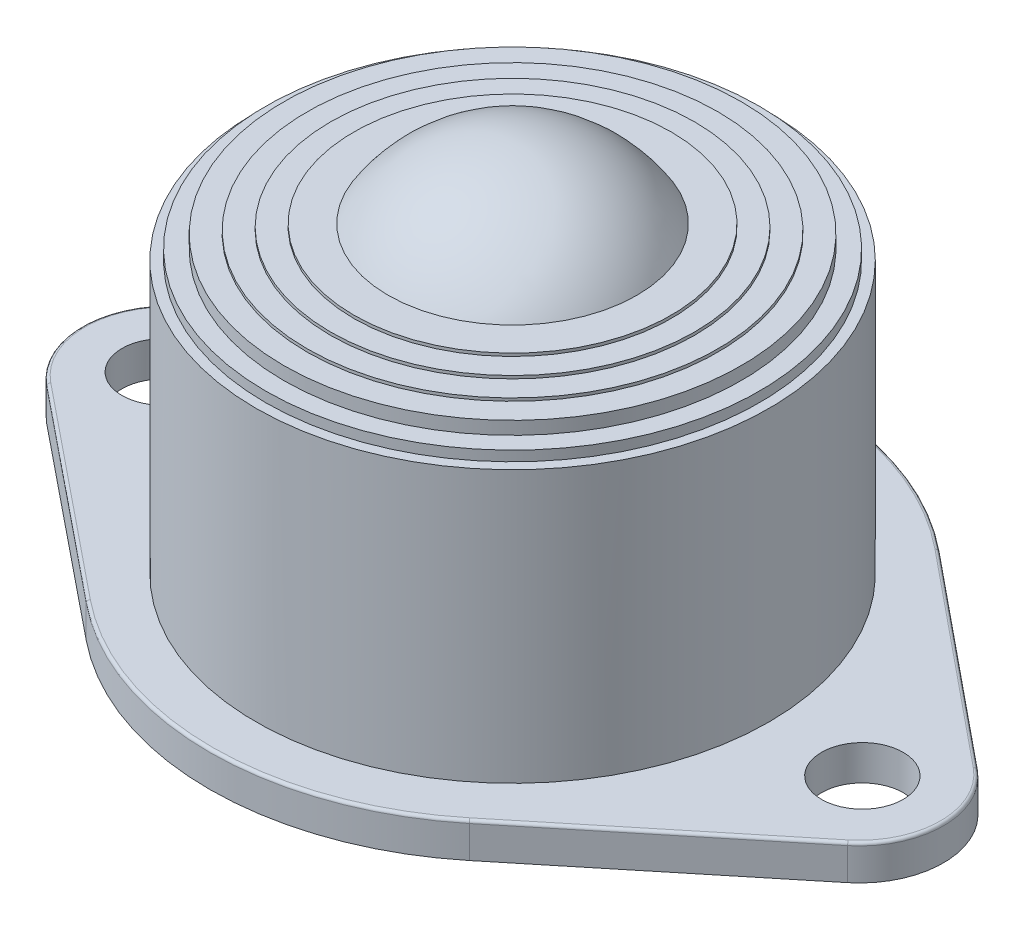
ISO-10303-21;
HEADER;
FILE_DESCRIPTION(('STEP AP214'),'2;1');
FILE_NAME('part.step','',(''),(''),'','','');
FILE_SCHEMA(('AUTOMOTIVE_DESIGN { 1 0 10303 214 1 1 1 1 }'));
ENDSEC;
DATA;
#1=APPLICATION_CONTEXT('core data for automotive mechanical design processes');
#2=APPLICATION_PROTOCOL_DEFINITION('international standard','automotive_design',2000,#1);
#3=PRODUCT_CONTEXT('',#1,'mechanical');
#4=PRODUCT('Part','Part','',(#3));
#5=PRODUCT_RELATED_PRODUCT_CATEGORY('part','',(#4));
#6=PRODUCT_DEFINITION_FORMATION('','',#4);
#7=PRODUCT_DEFINITION_CONTEXT('part definition',#1,'design');
#8=PRODUCT_DEFINITION('design','',#6,#7);
#9=PRODUCT_DEFINITION_SHAPE('','',#8);
#10=(LENGTH_UNIT() NAMED_UNIT(*) SI_UNIT(.MILLI.,.METRE.));
#11=(NAMED_UNIT(*) PLANE_ANGLE_UNIT() SI_UNIT($,.RADIAN.));
#12=(NAMED_UNIT(*) SI_UNIT($,.STERADIAN.) SOLID_ANGLE_UNIT());
#13=UNCERTAINTY_MEASURE_WITH_UNIT(LENGTH_MEASURE(1.E-05),#10,'distance_accuracy_value','');
#14=(GEOMETRIC_REPRESENTATION_CONTEXT(3) GLOBAL_UNCERTAINTY_ASSIGNED_CONTEXT((#13)) GLOBAL_UNIT_ASSIGNED_CONTEXT((#10,
#11,#12)) REPRESENTATION_CONTEXT('',''));
#15=CARTESIAN_POINT('',(0.,0.,0.));
#16=DIRECTION('',(0.,0.,1.));
#17=DIRECTION('',(1.,0.,0.));
#18=AXIS2_PLACEMENT_3D('',#15,#16,#17);
#19=CARTESIAN_POINT('',(0.,22.9759947398132,0.));
#20=CARTESIAN_POINT('',(0.,22.9759947398132,0.));
#21=CARTESIAN_POINT('',(0.,22.9759947398132,0.));
#22=CARTESIAN_POINT('',(0.,22.9759947398132,0.));
#23=CARTESIAN_POINT('',(0.,22.9759947398132,0.));
#24=CARTESIAN_POINT('',(0.,22.9759947398132,0.));
#25=CARTESIAN_POINT('',(0.,22.9759947398132,0.));
#26=CARTESIAN_POINT('',(0.,22.9759947398132,0.));
#27=CARTESIAN_POINT('',(0.,22.9759947398132,0.));
#28=CARTESIAN_POINT('',(0.,22.9170126934705,6.97436659000638));
#29=CARTESIAN_POINT('',(-6.97436659000639,22.9170126934705,6.97436659000638));
#30=CARTESIAN_POINT('',(-6.97436659000639,22.9170126934705,0.));
#31=CARTESIAN_POINT('',(-6.97436659000639,22.9170126934705,-6.97436659000638));
#32=CARTESIAN_POINT('',(0.,22.9170126934705,-6.97436659000638));
#33=CARTESIAN_POINT('',(6.97436659000637,22.9170126934705,-6.97436659000638));
#34=CARTESIAN_POINT('',(6.97436659000637,22.9170126934705,0.));
#35=CARTESIAN_POINT('',(6.97436659000637,22.9170126934705,6.97436659000638));
#36=CARTESIAN_POINT('',(0.,22.9170126934705,6.97436659000638));
#37=CARTESIAN_POINT('',(0.,17.,10.6668222767949));
#38=CARTESIAN_POINT('',(-10.6668222767949,17.,10.6668222767949));
#39=CARTESIAN_POINT('',(-10.6668222767949,17.,0.));
#40=CARTESIAN_POINT('',(-10.6668222767949,17.,-10.6668222767949));
#41=CARTESIAN_POINT('',(0.,17.,-10.6668222767949));
#42=CARTESIAN_POINT('',(10.6668222767949,17.,-10.6668222767949));
#43=CARTESIAN_POINT('',(10.6668222767949,17.,0.));
#44=CARTESIAN_POINT('',(10.6668222767949,17.,10.6668222767949));
#45=CARTESIAN_POINT('',(0.,17.,10.6668222767949));
#46=(BOUNDED_SURFACE() B_SPLINE_SURFACE(2,2,((#19,#20,#21,#22,#23,#24,#25,#26,#27),(#28,#29,#30,
#31,#32,#33,#34,#35,#36),(#37,#38,#39,#40,#41,#42,#43,#44,#45)),.UNSPECIFIED.,.F.,.T.,
.F.) B_SPLINE_SURFACE_WITH_KNOTS((3,3),(3,2,2,2,3),(-1.56233955305045,-0.557909055707331),
(-3.14159265358979,-1.5707963267949,0.,1.5707963267949,3.14159265358979),
.UNSPECIFIED.) GEOMETRIC_REPRESENTATION_ITEM() RATIONAL_B_SPLINE_SURFACE(((1.,0.707106781186548,
1.,0.707106781186548,1.,0.707106781186548,1.,0.707106781186548,1.),(0.876518362680228,
0.619792078085719,0.876518362680228,0.619792078085719,0.876518362680228,0.619792078085719,
0.876518362680228,0.619792078085719,0.876518362680228),(1.,0.707106781186548,1.,
0.707106781186548,1.,0.707106781186548,1.,0.707106781186548,1.))) REPRESENTATION_ITEM('') SURFACE());
#47=CARTESIAN_POINT('',(0.,17.,0.));
#48=DIRECTION('',(0.,1.,0.));
#49=DIRECTION('',(0.,0.,-1.));
#50=AXIS2_PLACEMENT_3D('',#47,#48,#49);
#51=CIRCLE('',#50,10.6668222767949);
#52=CARTESIAN_POINT('',(0.,17.,10.6668222767949));
#53=VERTEX_POINT('',#52);
#54=EDGE_CURVE('E289',#53,#53,#51,.T.);
#55=CARTESIAN_POINT('',(0.,10.2764488701974,-0.107399746392179));
#56=DIRECTION('',(-1.,0.,0.));
#57=DIRECTION('',(0.,0.,1.));
#58=AXIS2_PLACEMENT_3D('',#55,#56,#57);
#59=CIRCLE('',#58,12.7);
#60=CARTESIAN_POINT('',(0.,22.9759947398132,0.));
#61=VERTEX_POINT('',#60);
#62=EDGE_CURVE('E10',#53,#61,#59,.T.);
#63=ORIENTED_EDGE('',*,*,#54,.T.);
#64=ORIENTED_EDGE('',*,*,#62,.T.);
#65=ORIENTED_EDGE('',*,*,#62,.F.);
#66=EDGE_LOOP('',(#63,#64,#65));
#67=FACE_BOUND('',#66,.T.);
#68=ADVANCED_FACE('F16',(#67),#46,.F.);
#69=CARTESIAN_POINT('',(0.,-12.0235511298026,0.));
#70=DIRECTION('',(0.,-1.,0.));
#71=DIRECTION('',(0.,0.,-1.));
#72=AXIS2_PLACEMENT_3D('',#69,#70,#71);
#73=PLANE('',#72);
#74=CARTESIAN_POINT('',(30.,-12.0235511298026,0.));
#75=DIRECTION('',(0.,1.,0.));
#76=DIRECTION('',(1.,0.,0.));
#77=AXIS2_PLACEMENT_3D('',#74,#75,#76);
#78=CIRCLE('',#77,3.5);
#79=CARTESIAN_POINT('',(33.5,-12.0235511298026,0.));
#80=VERTEX_POINT('',#79);
#81=CARTESIAN_POINT('',(26.5,-12.0235511298026,0.));
#82=VERTEX_POINT('',#81);
#83=EDGE_CURVE('E410',#80,#82,#78,.T.);
#84=ORIENTED_EDGE('',*,*,#83,.T.);
#85=CARTESIAN_POINT('',(30.,-12.0235511298026,0.));
#86=DIRECTION('',(0.,1.,0.));
#87=DIRECTION('',(1.,0.,0.));
#88=AXIS2_PLACEMENT_3D('',#85,#86,#87);
#89=CIRCLE('',#88,3.5);
#90=EDGE_CURVE('E285',#82,#80,#89,.T.);
#91=ORIENTED_EDGE('',*,*,#90,.T.);
#92=EDGE_LOOP('',(#84,#91));
#93=FACE_BOUND('',#92,.T.);
#94=CARTESIAN_POINT('',(-30.,-12.0235511298026,0.));
#95=DIRECTION('',(0.,1.,0.));
#96=DIRECTION('',(1.,0.,0.));
#97=AXIS2_PLACEMENT_3D('',#94,#95,#96);
#98=CIRCLE('',#97,3.5);
#99=CARTESIAN_POINT('',(-26.5,-12.0235511298026,0.));
#100=VERTEX_POINT('',#99);
#101=CARTESIAN_POINT('',(-33.5,-12.0235511298026,0.));
#102=VERTEX_POINT('',#101);
#103=EDGE_CURVE('E281',#100,#102,#98,.T.);
#104=ORIENTED_EDGE('',*,*,#103,.T.);
#105=CARTESIAN_POINT('',(-30.,-12.0235511298026,0.));
#106=DIRECTION('',(0.,1.,0.));
#107=DIRECTION('',(1.,0.,0.));
#108=AXIS2_PLACEMENT_3D('',#105,#106,#107);
#109=CIRCLE('',#108,3.5);
#110=EDGE_CURVE('E386',#102,#100,#109,.T.);
#111=ORIENTED_EDGE('',*,*,#110,.T.);
#112=EDGE_LOOP('',(#104,#111));
#113=FACE_BOUND('',#112,.T.);
#114=CARTESIAN_POINT('',(-29.4726047080653,-12.0235511298026,0.));
#115=DIRECTION('',(0.,-1.,0.));
#116=DIRECTION('',(0.629177989448524,0.,-0.77726125440132));
#117=AXIS2_PLACEMENT_3D('',#114,#115,#116);
#118=CIRCLE('',#117,7.45648582596838);
#119=CARTESIAN_POINT('',(-34.1640614683995,-12.0235511298026,5.79563752651785));
#120=VERTEX_POINT('',#119);
#121=CARTESIAN_POINT('',(-34.1640614683995,-12.0235511298026,-5.79563752651785));
#122=VERTEX_POINT('',#121);
#123=EDGE_CURVE('E320',#120,#122,#118,.T.);
#124=ORIENTED_EDGE('',*,*,#123,.T.);
#125=DIRECTION('',(0.77726125440132,0.,-0.629177989448524));
#126=VECTOR('',#125,1.);
#127=CARTESIAN_POINT('',(-16.3586277256616,-12.0235511298026,-20.2087926144343));
#128=LINE('',#127,#126);
#129=CARTESIAN_POINT('',(-16.3586277256616,-12.0235511298026,-20.2087926144343));
#130=VERTEX_POINT('',#129);
#131=EDGE_CURVE('E321',#122,#130,#128,.T.);
#132=ORIENTED_EDGE('',*,*,#131,.T.);
#133=CARTESIAN_POINT('',(0.,-12.0235511298026,0.));
#134=DIRECTION('',(0.,-1.,0.));
#135=DIRECTION('',(0.629177989448524,0.,0.77726125440132));
#136=AXIS2_PLACEMENT_3D('',#133,#134,#135);
#137=CIRCLE('',#136,26.);
#138=CARTESIAN_POINT('',(16.4384790754404,-12.0235511298026,-20.1438925157554));
#139=VERTEX_POINT('',#138);
#140=EDGE_CURVE('E401',#130,#139,#137,.T.);
#141=ORIENTED_EDGE('',*,*,#140,.T.);
#142=DIRECTION('',(0.774765096759824,0.,0.632249195209247));
#143=VECTOR('',#142,1.);
#144=CARTESIAN_POINT('',(25.3722027613228,-12.0235511298026,-12.8535026488873));
#145=LINE('',#144,#143);
#146=CARTESIAN_POINT('',(34.3059264472051,-12.0235511298026,-5.56311278201924));
#147=VERTEX_POINT('',#146);
#148=EDGE_CURVE('E268',#139,#147,#145,.T.);
#149=ORIENTED_EDGE('',*,*,#148,.T.);
#150=CARTESIAN_POINT('',(29.7661329097837,-12.0235511298026,0.));
#151=DIRECTION('',(0.,-1.,0.));
#152=DIRECTION('',(-0.632249195209248,0.,0.774765096759823));
#153=AXIS2_PLACEMENT_3D('',#150,#151,#152);
#154=CIRCLE('',#153,7.18038642329781);
#155=CARTESIAN_POINT('',(34.3059264472051,-12.0235511298026,5.56311278201924));
#156=VERTEX_POINT('',#155);
#157=EDGE_CURVE('E316',#147,#156,#154,.T.);
#158=ORIENTED_EDGE('',*,*,#157,.T.);
#159=DIRECTION('',(-0.774765096759824,0.,0.632249195209247));
#160=VECTOR('',#159,1.);
#161=CARTESIAN_POINT('',(16.4384790754404,-12.0235511298026,20.1438925157554));
#162=LINE('',#161,#160);
#163=CARTESIAN_POINT('',(16.4384790754404,-12.0235511298026,20.1438925157554));
#164=VERTEX_POINT('',#163);
#165=EDGE_CURVE('E315',#156,#164,#162,.T.);
#166=ORIENTED_EDGE('',*,*,#165,.T.);
#167=CARTESIAN_POINT('',(0.,-12.0235511298026,0.));
#168=DIRECTION('',(0.,-1.,0.));
#169=DIRECTION('',(-0.632249195209247,0.,-0.774765096759824));
#170=AXIS2_PLACEMENT_3D('',#167,#168,#169);
#171=CIRCLE('',#170,26.);
#172=CARTESIAN_POINT('',(-16.3586277256616,-12.0235511298026,20.2087926144343));
#173=VERTEX_POINT('',#172);
#174=EDGE_CURVE('E261',#164,#173,#171,.T.);
#175=ORIENTED_EDGE('',*,*,#174,.T.);
#176=DIRECTION('',(-0.77726125440132,0.,-0.629177989448524));
#177=VECTOR('',#176,1.);
#178=CARTESIAN_POINT('',(-25.2613445970306,-12.0235511298026,13.0022150704761));
#179=LINE('',#178,#177);
#180=EDGE_CURVE('E278',#173,#120,#179,.T.);
#181=ORIENTED_EDGE('',*,*,#180,.T.);
#182=EDGE_LOOP('',(#124,#132,#141,#149,#158,#166,#175,#181));
#183=FACE_BOUND('',#182,.T.);
#184=ADVANCED_FACE('F519',(#93,#113,#183),#73,.T.);
#185=CARTESIAN_POINT('',(0.,2.47644887019741,0.));
#186=DIRECTION('',(0.,-1.,0.));
#187=DIRECTION('',(1.,0.,0.));
#188=AXIS2_PLACEMENT_3D('',#185,#186,#187);
#189=CYLINDRICAL_SURFACE('',#188,22.);
#190=CARTESIAN_POINT('',(0.,-9.02355112980259,0.));
#191=DIRECTION('',(0.,-1.,0.));
#192=DIRECTION('',(1.,0.,0.));
#193=AXIS2_PLACEMENT_3D('',#190,#191,#192);
#194=CIRCLE('',#193,22.);
#195=CARTESIAN_POINT('',(22.,-9.02355112980258,0.));
#196=VERTEX_POINT('',#195);
#197=CARTESIAN_POINT('',(-22.,-9.0235511298026,0.));
#198=VERTEX_POINT('',#197);
#199=EDGE_CURVE('E355',#196,#198,#194,.T.);
#200=ORIENTED_EDGE('',*,*,#199,.F.);
#201=CARTESIAN_POINT('',(0.,-9.02355112980259,0.));
#202=DIRECTION('',(0.,-1.,0.));
#203=DIRECTION('',(1.,0.,0.));
#204=AXIS2_PLACEMENT_3D('',#201,#202,#203);
#205=CIRCLE('',#204,22.);
#206=EDGE_CURVE('E397',#198,#196,#205,.T.);
#207=ORIENTED_EDGE('',*,*,#206,.F.);
#208=DIRECTION('',(0.,1.,0.));
#209=VECTOR('',#208,1.);
#210=CARTESIAN_POINT('',(-22.,2.4764488701974,0.));
#211=LINE('',#210,#209);
#212=CARTESIAN_POINT('',(-22.,14.269840459236,0.));
#213=VERTEX_POINT('',#212);
#214=EDGE_CURVE('E27',#198,#213,#211,.T.);
#215=ORIENTED_EDGE('',*,*,#214,.T.);
#216=CARTESIAN_POINT('',(0.,14.269840459236,0.));
#217=DIRECTION('',(0.,1.,0.));
#218=DIRECTION('',(1.,0.,0.));
#219=AXIS2_PLACEMENT_3D('',#216,#217,#218);
#220=CIRCLE('',#219,22.);
#221=CARTESIAN_POINT('',(0.,14.269840459236,22.));
#222=VERTEX_POINT('',#221);
#223=EDGE_CURVE('E246',#222,#213,#220,.T.);
#224=ORIENTED_EDGE('',*,*,#223,.F.);
#225=CARTESIAN_POINT('',(0.,14.269840459236,0.));
#226=DIRECTION('',(0.,1.,0.));
#227=DIRECTION('',(1.,0.,0.));
#228=AXIS2_PLACEMENT_3D('',#225,#226,#227);
#229=CIRCLE('',#228,22.);
#230=EDGE_CURVE('E240',#213,#222,#229,.T.);
#231=ORIENTED_EDGE('',*,*,#230,.F.);
#232=ORIENTED_EDGE('',*,*,#214,.F.);
#233=EDGE_LOOP('',(#200,#207,#215,#224,#231,#232));
#234=FACE_BOUND('',#233,.T.);
#235=ADVANCED_FACE('F631',(#234),#189,.T.);
#236=CARTESIAN_POINT('',(30.,98.3257497790811,0.));
#237=DIRECTION('',(0.,-1.,0.));
#238=DIRECTION('',(1.,0.,0.));
#239=AXIS2_PLACEMENT_3D('',#236,#237,#238);
#240=CYLINDRICAL_SURFACE('',#239,3.5);
#241=ORIENTED_EDGE('',*,*,#83,.F.);
#242=ORIENTED_EDGE('',*,*,#90,.F.);
#243=DIRECTION('',(0.,1.,0.));
#244=VECTOR('',#243,1.);
#245=CARTESIAN_POINT('',(26.5,98.3257497790811,0.));
#246=LINE('',#245,#244);
#247=CARTESIAN_POINT('',(26.5,-9.02355112980258,0.));
#248=VERTEX_POINT('',#247);
#249=EDGE_CURVE('E282',#82,#248,#246,.T.);
#250=ORIENTED_EDGE('',*,*,#249,.T.);
#251=CARTESIAN_POINT('',(30.,-9.02355112980258,0.));
#252=DIRECTION('',(0.,-1.,0.));
#253=DIRECTION('',(1.,0.,0.));
#254=AXIS2_PLACEMENT_3D('',#251,#252,#253);
#255=CIRCLE('',#254,3.5);
#256=EDGE_CURVE('E435',#248,#248,#255,.T.);
#257=ORIENTED_EDGE('',*,*,#256,.F.);
#258=ORIENTED_EDGE('',*,*,#249,.F.);
#259=EDGE_LOOP('',(#241,#242,#250,#257,#258));
#260=FACE_BOUND('',#259,.T.);
#261=ADVANCED_FACE('F524',(#260),#240,.F.);
#262=CARTESIAN_POINT('',(-30.,98.325749779081,0.));
#263=DIRECTION('',(0.,-1.,0.));
#264=DIRECTION('',(1.,0.,0.));
#265=AXIS2_PLACEMENT_3D('',#262,#263,#264);
#266=CYLINDRICAL_SURFACE('',#265,3.5);
#267=ORIENTED_EDGE('',*,*,#103,.F.);
#268=ORIENTED_EDGE('',*,*,#110,.F.);
#269=DIRECTION('',(0.,1.,0.));
#270=VECTOR('',#269,1.);
#271=CARTESIAN_POINT('',(-33.5,98.325749779081,0.));
#272=LINE('',#271,#270);
#273=CARTESIAN_POINT('',(-33.5,-9.0235511298026,0.));
#274=VERTEX_POINT('',#273);
#275=EDGE_CURVE('E83',#102,#274,#272,.T.);
#276=ORIENTED_EDGE('',*,*,#275,.T.);
#277=CARTESIAN_POINT('',(-30.,-9.0235511298026,0.));
#278=DIRECTION('',(0.,-1.,0.));
#279=DIRECTION('',(1.,0.,0.));
#280=AXIS2_PLACEMENT_3D('',#277,#278,#279);
#281=CIRCLE('',#280,3.5);
#282=EDGE_CURVE('E531',#274,#274,#281,.T.);
#283=ORIENTED_EDGE('',*,*,#282,.F.);
#284=ORIENTED_EDGE('',*,*,#275,.F.);
#285=EDGE_LOOP('',(#267,#268,#276,#283,#284));
#286=FACE_BOUND('',#285,.T.);
#287=ADVANCED_FACE('F650',(#286),#266,.F.);
#288=CARTESIAN_POINT('',(-34.1640614683995,-12.0235511298026,5.79563752651785));
#289=DIRECTION('',(-0.629177989448524,0.,0.77726125440132));
#290=DIRECTION('',(0.,1.,0.));
#291=AXIS2_PLACEMENT_3D('',#288,#289,#290);
#292=PLANE('',#291);
#293=DIRECTION('',(0.77726125440132,0.,0.629177989448524));
#294=VECTOR('',#293,1.);
#295=CARTESIAN_POINT('',(-14.0848460315505,-9.2735511298026,22.0493750269046));
#296=LINE('',#295,#294);
#297=CARTESIAN_POINT('',(-34.1640614683995,-9.27355112980262,5.79563752651785));
#298=VERTEX_POINT('',#297);
#299=CARTESIAN_POINT('',(-16.3586277256616,-9.27355112980261,20.2087926144343));
#300=VERTEX_POINT('',#299);
#301=EDGE_CURVE('E311',#298,#300,#296,.T.);
#302=ORIENTED_EDGE('',*,*,#301,.F.);
#303=DIRECTION('',(0.,1.,0.));
#304=VECTOR('',#303,1.);
#305=CARTESIAN_POINT('',(-34.1640614683995,-12.0235511298026,5.79563752651785));
#306=LINE('',#305,#304);
#307=EDGE_CURVE('E262',#120,#298,#306,.T.);
#308=ORIENTED_EDGE('',*,*,#307,.F.);
#309=ORIENTED_EDGE('',*,*,#180,.F.);
#310=DIRECTION('',(0.,1.,0.));
#311=VECTOR('',#310,1.);
#312=CARTESIAN_POINT('',(-16.3586277256616,-12.0235511298026,20.2087926144343));
#313=LINE('',#312,#311);
#314=EDGE_CURVE('E258',#173,#300,#313,.T.);
#315=ORIENTED_EDGE('',*,*,#314,.T.);
#316=EDGE_LOOP('',(#302,#308,#309,#315));
#317=FACE_BOUND('',#316,.T.);
#318=ADVANCED_FACE('F597',(#317),#292,.T.);
#319=CARTESIAN_POINT('',(0.,-12.0235511298026,0.));
#320=DIRECTION('',(0.,1.,0.));
#321=DIRECTION('',(-0.632249195209247,0.,-0.774765096759824));
#322=AXIS2_PLACEMENT_3D('',#319,#320,#321);
#323=CYLINDRICAL_SURFACE('',#322,26.);
#324=CARTESIAN_POINT('',(0.,-9.2735511298026,0.));
#325=DIRECTION('',(0.,1.,0.));
#326=DIRECTION('',(0.00197883221850006,0.,0.999998042109609));
#327=AXIS2_PLACEMENT_3D('',#324,#325,#326);
#328=CIRCLE('',#327,26.);
#329=CARTESIAN_POINT('',(16.4384790754404,-9.27355112980259,20.1438925157554));
#330=VERTEX_POINT('',#329);
#331=EDGE_CURVE('E303',#300,#330,#328,.T.);
#332=ORIENTED_EDGE('',*,*,#331,.F.);
#333=ORIENTED_EDGE('',*,*,#314,.F.);
#334=ORIENTED_EDGE('',*,*,#174,.F.);
#335=DIRECTION('',(0.,1.,0.));
#336=VECTOR('',#335,1.);
#337=CARTESIAN_POINT('',(16.4384790754404,-12.0235511298026,20.1438925157554));
#338=LINE('',#337,#336);
#339=EDGE_CURVE('E312',#164,#330,#338,.T.);
#340=ORIENTED_EDGE('',*,*,#339,.T.);
#341=EDGE_LOOP('',(#332,#333,#334,#340));
#342=FACE_BOUND('',#341,.T.);
#343=ADVANCED_FACE('F594',(#342),#323,.T.);
#344=CARTESIAN_POINT('',(-29.4726047080653,-12.0235511298026,0.));
#345=DIRECTION('',(0.,1.,0.));
#346=DIRECTION('',(0.629177989448524,0.,-0.77726125440132));
#347=AXIS2_PLACEMENT_3D('',#344,#345,#346);
#348=CYLINDRICAL_SURFACE('',#347,7.45648582596838);
#349=CARTESIAN_POINT('',(-29.4726047080653,-9.27355112980262,0.));
#350=DIRECTION('',(0.,1.,0.));
#351=DIRECTION('',(-1.,0.,0.));
#352=AXIS2_PLACEMENT_3D('',#349,#350,#351);
#353=CIRCLE('',#352,7.45648582596838);
#354=CARTESIAN_POINT('',(-34.1640614683995,-9.27355112980261,-5.79563752651785));
#355=VERTEX_POINT('',#354);
#356=EDGE_CURVE('E346',#355,#298,#353,.T.);
#357=ORIENTED_EDGE('',*,*,#356,.F.);
#358=DIRECTION('',(0.,1.,0.));
#359=VECTOR('',#358,1.);
#360=CARTESIAN_POINT('',(-34.1640614683995,-12.0235511298026,-5.79563752651785));
#361=LINE('',#360,#359);
#362=EDGE_CURVE('E317',#122,#355,#361,.T.);
#363=ORIENTED_EDGE('',*,*,#362,.F.);
#364=ORIENTED_EDGE('',*,*,#123,.F.);
#365=ORIENTED_EDGE('',*,*,#307,.T.);
#366=EDGE_LOOP('',(#357,#363,#364,#365));
#367=FACE_BOUND('',#366,.T.);
#368=ADVANCED_FACE('F602',(#367),#348,.T.);
#369=CARTESIAN_POINT('',(-16.3586277256616,-12.0235511298026,-20.2087926144343));
#370=DIRECTION('',(-0.629177989448524,0.,-0.77726125440132));
#371=DIRECTION('',(-0.77726125440132,0.,0.629177989448524));
#372=AXIS2_PLACEMENT_3D('',#369,#370,#371);
#373=PLANE('',#372);
#374=DIRECTION('',(-0.77726125440132,0.,0.629177989448524));
#375=VECTOR('',#374,1.);
#376=CARTESIAN_POINT('',(-5.18212916018162,-9.2735511298026,-29.2559525708628));
#377=LINE('',#376,#375);
#378=CARTESIAN_POINT('',(-16.3586277256616,-9.27355112980261,-20.2087926144343));
#379=VERTEX_POINT('',#378);
#380=EDGE_CURVE('E298',#379,#355,#377,.T.);
#381=ORIENTED_EDGE('',*,*,#380,.F.);
#382=DIRECTION('',(0.,1.,0.));
#383=VECTOR('',#382,1.);
#384=CARTESIAN_POINT('',(-16.3586277256616,-12.0235511298026,-20.2087926144343));
#385=LINE('',#384,#383);
#386=EDGE_CURVE('E364',#130,#379,#385,.T.);
#387=ORIENTED_EDGE('',*,*,#386,.F.);
#388=ORIENTED_EDGE('',*,*,#131,.F.);
#389=ORIENTED_EDGE('',*,*,#362,.T.);
#390=EDGE_LOOP('',(#381,#387,#388,#389));
#391=FACE_BOUND('',#390,.T.);
#392=ADVANCED_FACE('F608',(#391),#373,.T.);
#393=CARTESIAN_POINT('',(0.,16.875,0.));
#394=DIRECTION('',(0.,1.,0.));
#395=DIRECTION('',(0.,0.,1.));
#396=AXIS2_PLACEMENT_3D('',#393,#394,#395);
#397=CYLINDRICAL_SURFACE('',#396,13.6132787783433);
#398=CARTESIAN_POINT('',(0.,17.,0.));
#399=DIRECTION('',(0.,1.,0.));
#400=DIRECTION('',(1.,0.,0.));
#401=AXIS2_PLACEMENT_3D('',#398,#399,#400);
#402=CIRCLE('',#401,13.6132787783433);
#403=CARTESIAN_POINT('',(0.,17.,13.6132787783433));
#404=VERTEX_POINT('',#403);
#405=CARTESIAN_POINT('',(0.,17.,-13.6132787783433));
#406=VERTEX_POINT('',#405);
#407=EDGE_CURVE('E536',#404,#406,#402,.T.);
#408=ORIENTED_EDGE('',*,*,#407,.F.);
#409=CARTESIAN_POINT('',(0.,17.,0.));
#410=DIRECTION('',(0.,1.,0.));
#411=DIRECTION('',(1.,0.,0.));
#412=AXIS2_PLACEMENT_3D('',#409,#410,#411);
#413=CIRCLE('',#412,13.6132787783433);
#414=EDGE_CURVE('E67',#406,#404,#413,.T.);
#415=ORIENTED_EDGE('',*,*,#414,.F.);
#416=DIRECTION('',(0.,-1.,0.));
#417=VECTOR('',#416,1.);
#418=CARTESIAN_POINT('',(0.,16.875,-13.6132787783433));
#419=LINE('',#418,#417);
#420=CARTESIAN_POINT('',(0.,16.75,-13.6132787783433));
#421=VERTEX_POINT('',#420);
#422=EDGE_CURVE('E339',#406,#421,#419,.T.);
#423=ORIENTED_EDGE('',*,*,#422,.T.);
#424=CARTESIAN_POINT('',(0.,16.75,0.));
#425=DIRECTION('',(0.,1.,0.));
#426=DIRECTION('',(1.,0.,0.));
#427=AXIS2_PLACEMENT_3D('',#424,#425,#426);
#428=CIRCLE('',#427,13.6132787783433);
#429=CARTESIAN_POINT('',(0.,16.75,13.6132787783433));
#430=VERTEX_POINT('',#429);
#431=EDGE_CURVE('E335',#421,#430,#428,.T.);
#432=ORIENTED_EDGE('',*,*,#431,.T.);
#433=CARTESIAN_POINT('',(0.,16.75,0.));
#434=DIRECTION('',(0.,1.,0.));
#435=DIRECTION('',(1.,0.,0.));
#436=AXIS2_PLACEMENT_3D('',#433,#434,#435);
#437=CIRCLE('',#436,13.6132787783433);
#438=EDGE_CURVE('E331',#430,#421,#437,.T.);
#439=ORIENTED_EDGE('',*,*,#438,.T.);
#440=ORIENTED_EDGE('',*,*,#422,.F.);
#441=EDGE_LOOP('',(#408,#415,#423,#432,#439,#440));
#442=FACE_BOUND('',#441,.T.);
#443=ADVANCED_FACE('F674',(#442),#397,.T.);
#444=CARTESIAN_POINT('',(0.,16.75,13.6132787783433));
#445=DIRECTION('',(0.,1.,0.));
#446=DIRECTION('',(1.,0.,0.));
#447=AXIS2_PLACEMENT_3D('',#444,#445,#446);
#448=PLANE('',#447);
#449=ORIENTED_EDGE('',*,*,#438,.F.);
#450=ORIENTED_EDGE('',*,*,#431,.F.);
#451=EDGE_LOOP('',(#449,#450));
#452=FACE_BOUND('',#451,.T.);
#453=CARTESIAN_POINT('',(0.,16.75,0.));
#454=DIRECTION('',(0.,1.,0.));
#455=DIRECTION('',(1.,0.,0.));
#456=AXIS2_PLACEMENT_3D('',#453,#454,#455);
#457=CIRCLE('',#456,15.6132787783433);
#458=CARTESIAN_POINT('',(0.,16.75,15.6132787783433));
#459=VERTEX_POINT('',#458);
#460=CARTESIAN_POINT('',(0.,16.75,-15.6132787783433));
#461=VERTEX_POINT('',#460);
#462=EDGE_CURVE('E256',#459,#461,#457,.T.);
#463=ORIENTED_EDGE('',*,*,#462,.T.);
#464=CARTESIAN_POINT('',(0.,16.75,0.));
#465=DIRECTION('',(0.,1.,0.));
#466=DIRECTION('',(1.,0.,0.));
#467=AXIS2_PLACEMENT_3D('',#464,#465,#466);
#468=CIRCLE('',#467,15.6132787783433);
#469=EDGE_CURVE('E302',#461,#459,#468,.T.);
#470=ORIENTED_EDGE('',*,*,#469,.T.);
#471=EDGE_LOOP('',(#463,#470));
#472=FACE_BOUND('',#471,.T.);
#473=ADVANCED_FACE('F677',(#452,#472),#448,.T.);
#474=CARTESIAN_POINT('',(0.,16.625,0.));
#475=DIRECTION('',(0.,1.,0.));
#476=DIRECTION('',(0.,0.,1.));
#477=AXIS2_PLACEMENT_3D('',#474,#475,#476);
#478=CYLINDRICAL_SURFACE('',#477,15.6132787783433);
#479=ORIENTED_EDGE('',*,*,#462,.F.);
#480=ORIENTED_EDGE('',*,*,#469,.F.);
#481=DIRECTION('',(0.,-1.,0.));
#482=VECTOR('',#481,1.);
#483=CARTESIAN_POINT('',(0.,16.625,-15.6132787783433));
#484=LINE('',#483,#482);
#485=CARTESIAN_POINT('',(0.,16.5,-15.6132787783433));
#486=VERTEX_POINT('',#485);
#487=EDGE_CURVE('E336',#461,#486,#484,.T.);
#488=ORIENTED_EDGE('',*,*,#487,.T.);
#489=CARTESIAN_POINT('',(0.,16.5,0.));
#490=DIRECTION('',(0.,1.,0.));
#491=DIRECTION('',(1.,0.,0.));
#492=AXIS2_PLACEMENT_3D('',#489,#490,#491);
#493=CIRCLE('',#492,15.6132787783433);
#494=CARTESIAN_POINT('',(0.,16.5,15.6132787783433));
#495=VERTEX_POINT('',#494);
#496=EDGE_CURVE('E252',#486,#495,#493,.T.);
#497=ORIENTED_EDGE('',*,*,#496,.T.);
#498=CARTESIAN_POINT('',(0.,16.5,0.));
#499=DIRECTION('',(0.,1.,0.));
#500=DIRECTION('',(1.,0.,0.));
#501=AXIS2_PLACEMENT_3D('',#498,#499,#500);
#502=CIRCLE('',#501,15.6132787783433);
#503=EDGE_CURVE('E257',#495,#486,#502,.T.);
#504=ORIENTED_EDGE('',*,*,#503,.T.);
#505=ORIENTED_EDGE('',*,*,#487,.F.);
#506=EDGE_LOOP('',(#479,#480,#488,#497,#504,#505));
#507=FACE_BOUND('',#506,.T.);
#508=ADVANCED_FACE('F642',(#507),#478,.T.);
#509=CARTESIAN_POINT('',(0.,16.5,15.6132787783433));
#510=DIRECTION('',(0.,1.,0.));
#511=DIRECTION('',(1.,0.,0.));
#512=AXIS2_PLACEMENT_3D('',#509,#510,#511);
#513=PLANE('',#512);
#514=ORIENTED_EDGE('',*,*,#503,.F.);
#515=ORIENTED_EDGE('',*,*,#496,.F.);
#516=EDGE_LOOP('',(#514,#515));
#517=FACE_BOUND('',#516,.T.);
#518=CARTESIAN_POINT('',(0.,16.5,0.));
#519=DIRECTION('',(0.,1.,0.));
#520=DIRECTION('',(1.,0.,0.));
#521=AXIS2_PLACEMENT_3D('',#518,#519,#520);
#522=CIRCLE('',#521,17.6132787783433);
#523=CARTESIAN_POINT('',(0.,16.5,17.6132787783433));
#524=VERTEX_POINT('',#523);
#525=CARTESIAN_POINT('',(0.,16.5,-17.6132787783433));
#526=VERTEX_POINT('',#525);
#527=EDGE_CURVE('E374',#524,#526,#522,.T.);
#528=ORIENTED_EDGE('',*,*,#527,.T.);
#529=CARTESIAN_POINT('',(0.,16.5,0.));
#530=DIRECTION('',(0.,1.,0.));
#531=DIRECTION('',(1.,0.,0.));
#532=AXIS2_PLACEMENT_3D('',#529,#530,#531);
#533=CIRCLE('',#532,17.6132787783433);
#534=EDGE_CURVE('E440',#526,#524,#533,.T.);
#535=ORIENTED_EDGE('',*,*,#534,.T.);
#536=EDGE_LOOP('',(#528,#535));
#537=FACE_BOUND('',#536,.T.);
#538=ADVANCED_FACE('F563',(#517,#537),#513,.T.);
#539=CARTESIAN_POINT('',(0.,16.375,0.));
#540=DIRECTION('',(0.,1.,0.));
#541=DIRECTION('',(0.,0.,1.));
#542=AXIS2_PLACEMENT_3D('',#539,#540,#541);
#543=CYLINDRICAL_SURFACE('',#542,17.6132787783433);
#544=ORIENTED_EDGE('',*,*,#527,.F.);
#545=ORIENTED_EDGE('',*,*,#534,.F.);
#546=DIRECTION('',(0.,-1.,0.));
#547=VECTOR('',#546,1.);
#548=CARTESIAN_POINT('',(0.,16.375,-17.6132787783433));
#549=LINE('',#548,#547);
#550=CARTESIAN_POINT('',(0.,16.25,-17.6132787783433));
#551=VERTEX_POINT('',#550);
#552=EDGE_CURVE('E277',#526,#551,#549,.T.);
#553=ORIENTED_EDGE('',*,*,#552,.T.);
#554=CARTESIAN_POINT('',(0.,16.25,0.));
#555=DIRECTION('',(0.,1.,0.));
#556=DIRECTION('',(1.,0.,0.));
#557=AXIS2_PLACEMENT_3D('',#554,#555,#556);
#558=CIRCLE('',#557,17.6132787783433);
#559=CARTESIAN_POINT('',(0.,16.25,17.6132787783433));
#560=VERTEX_POINT('',#559);
#561=EDGE_CURVE('E369',#551,#560,#558,.T.);
#562=ORIENTED_EDGE('',*,*,#561,.T.);
#563=CARTESIAN_POINT('',(0.,16.25,0.));
#564=DIRECTION('',(0.,1.,0.));
#565=DIRECTION('',(1.,0.,0.));
#566=AXIS2_PLACEMENT_3D('',#563,#564,#565);
#567=CIRCLE('',#566,17.6132787783433);
#568=EDGE_CURVE('E365',#560,#551,#567,.T.);
#569=ORIENTED_EDGE('',*,*,#568,.T.);
#570=ORIENTED_EDGE('',*,*,#552,.F.);
#571=EDGE_LOOP('',(#544,#545,#553,#562,#569,#570));
#572=FACE_BOUND('',#571,.T.);
#573=ADVANCED_FACE('F566',(#572),#543,.T.);
#574=CARTESIAN_POINT('',(0.,16.25,17.6132787783433));
#575=DIRECTION('',(0.,1.,0.));
#576=DIRECTION('',(1.,0.,0.));
#577=AXIS2_PLACEMENT_3D('',#574,#575,#576);
#578=PLANE('',#577);
#579=ORIENTED_EDGE('',*,*,#568,.F.);
#580=ORIENTED_EDGE('',*,*,#561,.F.);
#581=EDGE_LOOP('',(#579,#580));
#582=FACE_BOUND('',#581,.T.);
#583=CARTESIAN_POINT('',(0.,16.25,0.));
#584=DIRECTION('',(0.,1.,0.));
#585=DIRECTION('',(1.,0.,0.));
#586=AXIS2_PLACEMENT_3D('',#583,#584,#585);
#587=CIRCLE('',#586,19.6132787783433);
#588=CARTESIAN_POINT('',(0.,16.25,19.6132787783433));
#589=VERTEX_POINT('',#588);
#590=CARTESIAN_POINT('',(0.,16.25,-19.6132787783433));
#591=VERTEX_POINT('',#590);
#592=EDGE_CURVE('E343',#589,#591,#587,.T.);
#593=ORIENTED_EDGE('',*,*,#592,.T.);
#594=CARTESIAN_POINT('',(0.,16.25,0.));
#595=DIRECTION('',(0.,1.,0.));
#596=DIRECTION('',(1.,0.,0.));
#597=AXIS2_PLACEMENT_3D('',#594,#595,#596);
#598=CIRCLE('',#597,19.6132787783433);
#599=EDGE_CURVE('E439',#591,#589,#598,.T.);
#600=ORIENTED_EDGE('',*,*,#599,.T.);
#601=EDGE_LOOP('',(#593,#600));
#602=FACE_BOUND('',#601,.T.);
#603=ADVANCED_FACE('F571',(#582,#602),#578,.T.);
#604=CARTESIAN_POINT('',(0.,15.6926349792645,0.));
#605=DIRECTION('',(0.,1.,0.));
#606=DIRECTION('',(0.,0.,1.));
#607=AXIS2_PLACEMENT_3D('',#604,#605,#606);
#608=CYLINDRICAL_SURFACE('',#607,19.6132787783433);
#609=ORIENTED_EDGE('',*,*,#592,.F.);
#610=ORIENTED_EDGE('',*,*,#599,.F.);
#611=DIRECTION('',(0.,-1.,0.));
#612=VECTOR('',#611,1.);
#613=CARTESIAN_POINT('',(0.,15.6926349792645,-19.6132787783433));
#614=LINE('',#613,#612);
#615=CARTESIAN_POINT('',(0.,15.1352699585289,-19.6132787783433));
#616=VERTEX_POINT('',#615);
#617=EDGE_CURVE('E370',#591,#616,#614,.T.);
#618=ORIENTED_EDGE('',*,*,#617,.T.);
#619=CARTESIAN_POINT('',(0.,15.1352699585289,0.));
#620=DIRECTION('',(0.,1.,0.));
#621=DIRECTION('',(1.,0.,0.));
#622=AXIS2_PLACEMENT_3D('',#619,#620,#621);
#623=CIRCLE('',#622,19.6132787783433);
#624=CARTESIAN_POINT('',(0.,15.1352699585289,19.6132787783433));
#625=VERTEX_POINT('',#624);
#626=EDGE_CURVE('E340',#616,#625,#623,.T.);
#627=ORIENTED_EDGE('',*,*,#626,.T.);
#628=CARTESIAN_POINT('',(0.,15.1352699585289,0.));
#629=DIRECTION('',(0.,1.,0.));
#630=DIRECTION('',(1.,0.,0.));
#631=AXIS2_PLACEMENT_3D('',#628,#629,#630);
#632=CIRCLE('',#631,19.6132787783433);
#633=EDGE_CURVE('E20',#625,#616,#632,.T.);
#634=ORIENTED_EDGE('',*,*,#633,.T.);
#635=ORIENTED_EDGE('',*,*,#617,.F.);
#636=EDGE_LOOP('',(#609,#610,#618,#627,#634,#635));
#637=FACE_BOUND('',#636,.T.);
#638=ADVANCED_FACE('F574',(#637),#608,.T.);
#639=CARTESIAN_POINT('',(0.,15.1352699585289,19.6132787783433));
#640=DIRECTION('',(0.,1.,0.));
#641=DIRECTION('',(1.,0.,0.));
#642=AXIS2_PLACEMENT_3D('',#639,#640,#641);
#643=PLANE('',#642);
#644=ORIENTED_EDGE('',*,*,#633,.F.);
#645=ORIENTED_EDGE('',*,*,#626,.F.);
#646=EDGE_LOOP('',(#644,#645));
#647=FACE_BOUND('',#646,.T.);
#648=CARTESIAN_POINT('',(0.,15.1352699585289,0.));
#649=DIRECTION('',(0.,1.,0.));
#650=DIRECTION('',(1.,0.,0.));
#651=AXIS2_PLACEMENT_3D('',#648,#649,#650);
#652=CIRCLE('',#651,21.1679682371002);
#653=CARTESIAN_POINT('',(0.,15.1352699585289,21.1679682371002));
#654=VERTEX_POINT('',#653);
#655=CARTESIAN_POINT('',(0.,15.1352699585289,-21.1679682371002));
#656=VERTEX_POINT('',#655);
#657=EDGE_CURVE('E235',#654,#656,#652,.T.);
#658=ORIENTED_EDGE('',*,*,#657,.T.);
#659=CARTESIAN_POINT('',(0.,15.1352699585289,0.));
#660=DIRECTION('',(0.,1.,0.));
#661=DIRECTION('',(1.,0.,0.));
#662=AXIS2_PLACEMENT_3D('',#659,#660,#661);
#663=CIRCLE('',#662,21.1679682371002);
#664=EDGE_CURVE('E328',#656,#654,#663,.T.);
#665=ORIENTED_EDGE('',*,*,#664,.T.);
#666=EDGE_LOOP('',(#658,#665));
#667=FACE_BOUND('',#666,.T.);
#668=ADVANCED_FACE('F665',(#647,#667),#643,.T.);
#669=CARTESIAN_POINT('',(0.,14.7025552088825,0.));
#670=DIRECTION('',(0.,1.,0.));
#671=DIRECTION('',(0.,0.,1.));
#672=AXIS2_PLACEMENT_3D('',#669,#670,#671);
#673=CYLINDRICAL_SURFACE('',#672,21.1679682371002);
#674=ORIENTED_EDGE('',*,*,#657,.F.);
#675=ORIENTED_EDGE('',*,*,#664,.F.);
#676=DIRECTION('',(0.,-1.,0.));
#677=VECTOR('',#676,1.);
#678=CARTESIAN_POINT('',(0.,14.7025552088825,-21.1679682371002));
#679=LINE('',#678,#677);
#680=CARTESIAN_POINT('',(0.,14.269840459236,-21.1679682371002));
#681=VERTEX_POINT('',#680);
#682=EDGE_CURVE('E232',#656,#681,#679,.T.);
#683=ORIENTED_EDGE('',*,*,#682,.T.);
#684=CARTESIAN_POINT('',(0.,14.269840459236,0.));
#685=DIRECTION('',(0.,1.,0.));
#686=DIRECTION('',(1.,0.,0.));
#687=AXIS2_PLACEMENT_3D('',#684,#685,#686);
#688=CIRCLE('',#687,21.1679682371002);
#689=CARTESIAN_POINT('',(0.,14.269840459236,21.1679682371002));
#690=VERTEX_POINT('',#689);
#691=EDGE_CURVE('E226',#681,#690,#688,.T.);
#692=ORIENTED_EDGE('',*,*,#691,.T.);
#693=CARTESIAN_POINT('',(0.,14.269840459236,0.));
#694=DIRECTION('',(0.,1.,0.));
#695=DIRECTION('',(1.,0.,0.));
#696=AXIS2_PLACEMENT_3D('',#693,#694,#695);
#697=CIRCLE('',#696,21.1679682371002);
#698=EDGE_CURVE('E230',#690,#681,#697,.T.);
#699=ORIENTED_EDGE('',*,*,#698,.T.);
#700=ORIENTED_EDGE('',*,*,#682,.F.);
#701=EDGE_LOOP('',(#674,#675,#683,#692,#699,#700));
#702=FACE_BOUND('',#701,.T.);
#703=ADVANCED_FACE('F229',(#702),#673,.T.);
#704=CARTESIAN_POINT('',(0.,14.269840459236,21.1679682371002));
#705=DIRECTION('',(0.,1.,0.));
#706=DIRECTION('',(1.,0.,0.));
#707=AXIS2_PLACEMENT_3D('',#704,#705,#706);
#708=PLANE('',#707);
#709=ORIENTED_EDGE('',*,*,#698,.F.);
#710=ORIENTED_EDGE('',*,*,#691,.F.);
#711=EDGE_LOOP('',(#709,#710));
#712=FACE_BOUND('',#711,.T.);
#713=ORIENTED_EDGE('',*,*,#223,.T.);
#714=ORIENTED_EDGE('',*,*,#230,.T.);
#715=EDGE_LOOP('',(#713,#714));
#716=FACE_BOUND('',#715,.T.);
#717=ADVANCED_FACE('F237',(#712,#716),#708,.T.);
#718=CARTESIAN_POINT('',(0.,17.,0.));
#719=DIRECTION('',(0.,1.,0.));
#720=DIRECTION('',(1.,0.,0.));
#721=AXIS2_PLACEMENT_3D('',#718,#719,#720);
#722=PLANE('',#721);
#723=ORIENTED_EDGE('',*,*,#54,.F.);
#724=EDGE_LOOP('',(#723));
#725=FACE_BOUND('',#724,.T.);
#726=ORIENTED_EDGE('',*,*,#407,.T.);
#727=ORIENTED_EDGE('',*,*,#414,.T.);
#728=EDGE_LOOP('',(#726,#727));
#729=FACE_BOUND('',#728,.T.);
#730=ADVANCED_FACE('F668',(#725,#729),#722,.T.);
#731=CARTESIAN_POINT('',(37.,-9.02355112980258,0.));
#732=DIRECTION('',(0.,1.,0.));
#733=DIRECTION('',(1.,0.,0.));
#734=AXIS2_PLACEMENT_3D('',#731,#732,#733);
#735=PLANE('',#734);
#736=ORIENTED_EDGE('',*,*,#282,.T.);
#737=EDGE_LOOP('',(#736));
#738=FACE_BOUND('',#737,.T.);
#739=ORIENTED_EDGE('',*,*,#256,.T.);
#740=EDGE_LOOP('',(#739));
#741=FACE_BOUND('',#740,.T.);
#742=ORIENTED_EDGE('',*,*,#199,.T.);
#743=ORIENTED_EDGE('',*,*,#206,.T.);
#744=EDGE_LOOP('',(#742,#743));
#745=FACE_BOUND('',#744,.T.);
#746=DIRECTION('',(-0.774765096759824,0.,0.632249195209247));
#747=VECTOR('',#746,1.);
#748=CARTESIAN_POINT('',(27.3852444470474,-9.02355112980259,10.8880759768671));
#749=LINE('',#748,#747);
#750=CARTESIAN_POINT('',(34.1478641484028,-9.02355112980259,5.36942150782928));
#751=VERTEX_POINT('',#750);
#752=CARTESIAN_POINT('',(16.2804167766381,-9.02355112980259,19.9502012415655));
#753=VERTEX_POINT('',#752);
#754=EDGE_CURVE('E360',#751,#753,#749,.T.);
#755=ORIENTED_EDGE('',*,*,#754,.F.);
#756=CARTESIAN_POINT('',(29.7661329097837,-9.02355112980259,0.));
#757=DIRECTION('',(0.,-1.,0.));
#758=DIRECTION('',(1.,0.,0.));
#759=AXIS2_PLACEMENT_3D('',#756,#757,#758);
#760=CIRCLE('',#759,6.93038642329781);
#761=CARTESIAN_POINT('',(34.1478641484028,-9.02355112980259,-5.36942150782929));
#762=VERTEX_POINT('',#761);
#763=EDGE_CURVE('E263',#762,#751,#760,.T.);
#764=ORIENTED_EDGE('',*,*,#763,.F.);
#765=DIRECTION('',(0.774765096759824,0.,0.632249195209247));
#766=VECTOR('',#765,1.);
#767=CARTESIAN_POINT('',(36.3189681329298,-9.02355112980258,-3.59768610999903));
#768=LINE('',#767,#766);
#769=CARTESIAN_POINT('',(16.2804167766381,-9.02355112980259,-19.9502012415655));
#770=VERTEX_POINT('',#769);
#771=EDGE_CURVE('E379',#770,#762,#768,.T.);
#772=ORIENTED_EDGE('',*,*,#771,.F.);
#773=CARTESIAN_POINT('',(0.,-9.0235511298026,0.));
#774=DIRECTION('',(0.,-1.,0.));
#775=DIRECTION('',(0.00197883221850049,0.,-0.999998042109609));
#776=AXIS2_PLACEMENT_3D('',#773,#774,#775);
#777=CIRCLE('',#776,25.75);
#778=CARTESIAN_POINT('',(-16.2013332282995,-9.0235511298026,-20.014477300834));
#779=VERTEX_POINT('',#778);
#780=EDGE_CURVE('E294',#779,#770,#777,.T.);
#781=ORIENTED_EDGE('',*,*,#780,.F.);
#782=DIRECTION('',(0.77726125440132,0.,-0.629177989448524));
#783=VECTOR('',#782,1.);
#784=CARTESIAN_POINT('',(-5.0248346628195,-9.0235511298026,-29.0616372572625));
#785=LINE('',#784,#783);
#786=CARTESIAN_POINT('',(-34.0067669710374,-9.02355112980261,-5.60132221291752));
#787=VERTEX_POINT('',#786);
#788=EDGE_CURVE('E295',#787,#779,#785,.T.);
#789=ORIENTED_EDGE('',*,*,#788,.F.);
#790=CARTESIAN_POINT('',(-29.4726047080653,-9.02355112980261,0.));
#791=DIRECTION('',(0.,-1.,0.));
#792=DIRECTION('',(-1.,0.,0.));
#793=AXIS2_PLACEMENT_3D('',#790,#791,#792);
#794=CIRCLE('',#793,7.20648582596838);
#795=CARTESIAN_POINT('',(-34.0067669710374,-9.02355112980261,5.60132221291751));
#796=VERTEX_POINT('',#795);
#797=EDGE_CURVE('E351',#796,#787,#794,.T.);
#798=ORIENTED_EDGE('',*,*,#797,.F.);
#799=DIRECTION('',(-0.77726125440132,0.,-0.629177989448524));
#800=VECTOR('',#799,1.);
#801=CARTESIAN_POINT('',(-13.9275515341884,-9.0235511298026,21.8550597133043));
#802=LINE('',#801,#800);
#803=CARTESIAN_POINT('',(-16.2013332282995,-9.02355112980261,20.014477300834));
#804=VERTEX_POINT('',#803);
#805=EDGE_CURVE('E375',#804,#796,#802,.T.);
#806=ORIENTED_EDGE('',*,*,#805,.F.);
#807=CARTESIAN_POINT('',(0.,-9.0235511298026,0.));
#808=DIRECTION('',(0.,-1.,0.));
#809=DIRECTION('',(0.00197883221850006,0.,0.999998042109609));
#810=AXIS2_PLACEMENT_3D('',#807,#808,#809);
#811=CIRCLE('',#810,25.75);
#812=EDGE_CURVE('E308',#753,#804,#811,.T.);
#813=ORIENTED_EDGE('',*,*,#812,.F.);
#814=EDGE_LOOP('',(#755,#764,#772,#781,#789,#798,#806,#813));
#815=FACE_BOUND('',#814,.T.);
#816=ADVANCED_FACE('F528',(#738,#741,#745,#815),#735,.T.);
#817=CARTESIAN_POINT('',(16.4384790754404,-12.0235511298026,20.1438925157554));
#818=DIRECTION('',(0.632249195209247,0.,0.774765096759824));
#819=DIRECTION('',(0.,-1.,0.));
#820=AXIS2_PLACEMENT_3D('',#817,#818,#819);
#821=PLANE('',#820);
#822=DIRECTION('',(0.774765096759824,0.,-0.632249195209247));
#823=VECTOR('',#822,1.);
#824=CARTESIAN_POINT('',(27.5433067458497,-9.27355112980259,11.0817672510571));
#825=LINE('',#824,#823);
#826=CARTESIAN_POINT('',(34.3059264472051,-9.27355112980259,5.56311278201924));
#827=VERTEX_POINT('',#826);
#828=EDGE_CURVE('E361',#330,#827,#825,.T.);
#829=ORIENTED_EDGE('',*,*,#828,.F.);
#830=ORIENTED_EDGE('',*,*,#339,.F.);
#831=ORIENTED_EDGE('',*,*,#165,.F.);
#832=DIRECTION('',(0.,1.,0.));
#833=VECTOR('',#832,1.);
#834=CARTESIAN_POINT('',(34.3059264472051,-12.0235511298026,5.56311278201924));
#835=LINE('',#834,#833);
#836=EDGE_CURVE('E272',#156,#827,#835,.T.);
#837=ORIENTED_EDGE('',*,*,#836,.T.);
#838=EDGE_LOOP('',(#829,#830,#831,#837));
#839=FACE_BOUND('',#838,.T.);
#840=ADVANCED_FACE('F18',(#839),#821,.T.);
#841=CARTESIAN_POINT('',(29.7661329097837,-12.0235511298026,0.));
#842=DIRECTION('',(0.,1.,0.));
#843=DIRECTION('',(-0.632249195209248,0.,0.774765096759823));
#844=AXIS2_PLACEMENT_3D('',#841,#842,#843);
#845=CYLINDRICAL_SURFACE('',#844,7.18038642329781);
#846=CARTESIAN_POINT('',(29.7661329097837,-9.27355112980259,0.));
#847=DIRECTION('',(0.,1.,0.));
#848=DIRECTION('',(1.,0.,0.));
#849=AXIS2_PLACEMENT_3D('',#846,#847,#848);
#850=CIRCLE('',#849,7.18038642329781);
#851=CARTESIAN_POINT('',(34.3059264472051,-9.27355112980259,-5.56311278201924));
#852=VERTEX_POINT('',#851);
#853=EDGE_CURVE('E266',#827,#852,#850,.T.);
#854=ORIENTED_EDGE('',*,*,#853,.F.);
#855=ORIENTED_EDGE('',*,*,#836,.F.);
#856=ORIENTED_EDGE('',*,*,#157,.F.);
#857=DIRECTION('',(0.,1.,0.));
#858=VECTOR('',#857,1.);
#859=CARTESIAN_POINT('',(34.3059264472051,-12.0235511298026,-5.56311278201924));
#860=LINE('',#859,#858);
#861=EDGE_CURVE('E273',#147,#852,#860,.T.);
#862=ORIENTED_EDGE('',*,*,#861,.T.);
#863=EDGE_LOOP('',(#854,#855,#856,#862));
#864=FACE_BOUND('',#863,.T.);
#865=ADVANCED_FACE('F623',(#864),#845,.T.);
#866=CARTESIAN_POINT('',(34.3059264472051,-12.0235511298026,-5.56311278201924));
#867=DIRECTION('',(0.632249195209247,0.,-0.774765096759824));
#868=DIRECTION('',(0.,-1.,0.));
#869=AXIS2_PLACEMENT_3D('',#866,#867,#868);
#870=PLANE('',#869);
#871=DIRECTION('',(-0.774765096759824,0.,-0.632249195209247));
#872=VECTOR('',#871,1.);
#873=CARTESIAN_POINT('',(36.4770304317321,-9.27355112980259,-3.79137738418899));
#874=LINE('',#873,#872);
#875=CARTESIAN_POINT('',(16.4384790754404,-9.27355112980259,-20.1438925157554));
#876=VERTEX_POINT('',#875);
#877=EDGE_CURVE('E382',#852,#876,#874,.T.);
#878=ORIENTED_EDGE('',*,*,#877,.F.);
#879=ORIENTED_EDGE('',*,*,#861,.F.);
#880=ORIENTED_EDGE('',*,*,#148,.F.);
#881=DIRECTION('',(0.,1.,0.));
#882=VECTOR('',#881,1.);
#883=CARTESIAN_POINT('',(16.4384790754404,-12.0235511298026,-20.1438925157554));
#884=LINE('',#883,#882);
#885=EDGE_CURVE('E307',#139,#876,#884,.T.);
#886=ORIENTED_EDGE('',*,*,#885,.T.);
#887=EDGE_LOOP('',(#878,#879,#880,#886));
#888=FACE_BOUND('',#887,.T.);
#889=ADVANCED_FACE('F613',(#888),#870,.T.);
#890=CARTESIAN_POINT('',(0.,-12.0235511298026,0.));
#891=DIRECTION('',(0.,1.,0.));
#892=DIRECTION('',(0.629177989448524,0.,0.77726125440132));
#893=AXIS2_PLACEMENT_3D('',#890,#891,#892);
#894=CYLINDRICAL_SURFACE('',#893,26.);
#895=CARTESIAN_POINT('',(0.,-9.2735511298026,0.));
#896=DIRECTION('',(0.,1.,0.));
#897=DIRECTION('',(0.00197883221850049,0.,-0.999998042109609));
#898=AXIS2_PLACEMENT_3D('',#895,#896,#897);
#899=CIRCLE('',#898,26.);
#900=EDGE_CURVE('E290',#876,#379,#899,.T.);
#901=ORIENTED_EDGE('',*,*,#900,.F.);
#902=ORIENTED_EDGE('',*,*,#885,.F.);
#903=ORIENTED_EDGE('',*,*,#140,.F.);
#904=ORIENTED_EDGE('',*,*,#386,.T.);
#905=EDGE_LOOP('',(#901,#902,#903,#904));
#906=FACE_BOUND('',#905,.T.);
#907=ADVANCED_FACE('F610',(#906),#894,.T.);
#908=CARTESIAN_POINT('',(0.,-9.2735511298026,0.));
#909=DIRECTION('',(0.,1.,0.));
#910=DIRECTION('',(0.,0.,1.));
#911=AXIS2_PLACEMENT_3D('',#908,#909,#910);
#912=TOROIDAL_SURFACE('',#911,25.75,0.25);
#913=CARTESIAN_POINT('',(16.2804167766381,-9.27355112980259,19.9502012415655));
#914=DIRECTION('',(0.774765096759813,0.,-0.63224919520926));
#915=DIRECTION('',(0.,1.,0.));
#916=AXIS2_PLACEMENT_3D('',#913,#914,#915);
#917=CIRCLE('',#916,0.25);
#918=EDGE_CURVE('E462',#753,#330,#917,.T.);
#919=ORIENTED_EDGE('',*,*,#918,.F.);
#920=ORIENTED_EDGE('',*,*,#812,.T.);
#921=CARTESIAN_POINT('',(-16.2013332282995,-9.27355112980261,20.014477300834));
#922=DIRECTION('',(-0.777261254401313,0.,-0.629177989448533));
#923=DIRECTION('',(-0.629177989448533,0.,0.777261254401313));
#924=AXIS2_PLACEMENT_3D('',#921,#922,#923);
#925=CIRCLE('',#924,0.250000000000006);
#926=EDGE_CURVE('E350',#300,#804,#925,.T.);
#927=ORIENTED_EDGE('',*,*,#926,.F.);
#928=ORIENTED_EDGE('',*,*,#331,.T.);
#929=EDGE_LOOP('',(#919,#920,#927,#928));
#930=FACE_BOUND('',#929,.T.);
#931=ADVANCED_FACE('F612',(#930),#912,.T.);
#932=CARTESIAN_POINT('',(-13.9275515341884,-9.2735511298026,21.8550597133043));
#933=DIRECTION('',(0.777261254401318,0.,0.629177989448526));
#934=DIRECTION('',(-0.444896022912377,0.70710678118654,0.549606703740739));
#935=AXIS2_PLACEMENT_3D('',#932,#933,#934);
#936=CYLINDRICAL_SURFACE('',#935,0.25);
#937=ORIENTED_EDGE('',*,*,#926,.T.);
#938=ORIENTED_EDGE('',*,*,#805,.T.);
#939=CARTESIAN_POINT('',(-34.0067669710374,-9.27355112980262,5.60132221291751));
#940=DIRECTION('',(-0.77726125440132,0.,-0.629177989448523));
#941=DIRECTION('',(-0.629177989448523,0.,0.77726125440132));
#942=AXIS2_PLACEMENT_3D('',#939,#940,#941);
#943=CIRCLE('',#942,0.250000000000006);
#944=EDGE_CURVE('E417',#298,#796,#943,.T.);
#945=ORIENTED_EDGE('',*,*,#944,.F.);
#946=ORIENTED_EDGE('',*,*,#301,.T.);
#947=EDGE_LOOP('',(#937,#938,#945,#946));
#948=FACE_BOUND('',#947,.T.);
#949=ADVANCED_FACE('F620',(#948),#936,.T.);
#950=CARTESIAN_POINT('',(-29.4726047080653,-9.27355112980262,0.));
#951=DIRECTION('',(0.,1.,0.));
#952=DIRECTION('',(0.,0.,1.));
#953=AXIS2_PLACEMENT_3D('',#950,#951,#952);
#954=TOROIDAL_SURFACE('',#953,7.20648582596838,0.25);
#955=ORIENTED_EDGE('',*,*,#944,.T.);
#956=ORIENTED_EDGE('',*,*,#797,.T.);
#957=CARTESIAN_POINT('',(-34.0067669710374,-9.27355112980261,-5.60132221291752));
#958=DIRECTION('',(0.777261254401334,0.,-0.629177989448506));
#959=DIRECTION('',(-0.629177989448506,0.,-0.777261254401334));
#960=AXIS2_PLACEMENT_3D('',#957,#958,#959);
#961=CIRCLE('',#960,0.249999999999992);
#962=EDGE_CURVE('E250',#355,#787,#961,.T.);
#963=ORIENTED_EDGE('',*,*,#962,.F.);
#964=ORIENTED_EDGE('',*,*,#356,.T.);
#965=EDGE_LOOP('',(#955,#956,#963,#964));
#966=FACE_BOUND('',#965,.T.);
#967=ADVANCED_FACE('F647',(#966),#954,.T.);
#968=CARTESIAN_POINT('',(-5.0248346628195,-9.2735511298026,-29.0616372572625));
#969=DIRECTION('',(-0.777261254401322,0.,0.629177989448521));
#970=DIRECTION('',(-0.444896022912367,0.707106781186544,-0.549606703740742));
#971=AXIS2_PLACEMENT_3D('',#968,#969,#970);
#972=CYLINDRICAL_SURFACE('',#971,0.25);
#973=ORIENTED_EDGE('',*,*,#962,.T.);
#974=ORIENTED_EDGE('',*,*,#788,.T.);
#975=CARTESIAN_POINT('',(-16.2013332282995,-9.27355112980261,-20.014477300834));
#976=DIRECTION('',(0.777261254401318,0.,-0.629177989448526));
#977=DIRECTION('',(-0.629177989448526,0.,-0.777261254401318));
#978=AXIS2_PLACEMENT_3D('',#975,#976,#977);
#979=CIRCLE('',#978,0.25);
#980=EDGE_CURVE('E390',#379,#779,#979,.T.);
#981=ORIENTED_EDGE('',*,*,#980,.F.);
#982=ORIENTED_EDGE('',*,*,#380,.T.);
#983=EDGE_LOOP('',(#973,#974,#981,#982));
#984=FACE_BOUND('',#983,.T.);
#985=ADVANCED_FACE('F695',(#984),#972,.T.);
#986=CARTESIAN_POINT('',(0.,-9.2735511298026,0.));
#987=DIRECTION('',(0.,1.,0.));
#988=DIRECTION('',(0.00197883221849999,0.,-0.999998042109609));
#989=AXIS2_PLACEMENT_3D('',#986,#987,#988);
#990=TOROIDAL_SURFACE('',#989,25.75,0.25);
#991=ORIENTED_EDGE('',*,*,#980,.T.);
#992=ORIENTED_EDGE('',*,*,#780,.T.);
#993=CARTESIAN_POINT('',(16.2804167766381,-9.27355112980259,-19.9502012415655));
#994=DIRECTION('',(0.774765096759829,0.,0.632249195209241));
#995=DIRECTION('',(0.632249195209241,0.,-0.774765096759829));
#996=AXIS2_PLACEMENT_3D('',#993,#994,#995);
#997=CIRCLE('',#996,0.25);
#998=EDGE_CURVE('E325',#876,#770,#997,.T.);
#999=ORIENTED_EDGE('',*,*,#998,.F.);
#1000=ORIENTED_EDGE('',*,*,#900,.T.);
#1001=EDGE_LOOP('',(#991,#992,#999,#1000));
#1002=FACE_BOUND('',#1001,.T.);
#1003=ADVANCED_FACE('F483',(#1002),#990,.T.);
#1004=CARTESIAN_POINT('',(36.3189681329298,-9.27355112980259,-3.59768610999903));
#1005=DIRECTION('',(-0.774765096759819,0.,-0.632249195209253));
#1006=DIRECTION('',(0.447067693332207,0.707106781186544,-0.547841653745519));
#1007=AXIS2_PLACEMENT_3D('',#1004,#1005,#1006);
#1008=CYLINDRICAL_SURFACE('',#1007,0.25);
#1009=ORIENTED_EDGE('',*,*,#998,.T.);
#1010=ORIENTED_EDGE('',*,*,#771,.T.);
#1011=CARTESIAN_POINT('',(34.1478641484028,-9.27355112980259,-5.36942150782929));
#1012=DIRECTION('',(0.774765096759826,0.,0.632249195209244));
#1013=DIRECTION('',(0.632249195209244,0.,-0.774765096759826));
#1014=AXIS2_PLACEMENT_3D('',#1011,#1012,#1013);
#1015=CIRCLE('',#1014,0.249999999999996);
#1016=EDGE_CURVE('E267',#852,#762,#1015,.T.);
#1017=ORIENTED_EDGE('',*,*,#1016,.F.);
#1018=ORIENTED_EDGE('',*,*,#877,.T.);
#1019=EDGE_LOOP('',(#1009,#1010,#1017,#1018));
#1020=FACE_BOUND('',#1019,.T.);
#1021=ADVANCED_FACE('F477',(#1020),#1008,.T.);
#1022=CARTESIAN_POINT('',(29.7661329097837,-9.27355112980259,0.));
#1023=DIRECTION('',(0.,1.,0.));
#1024=DIRECTION('',(0.,0.,1.));
#1025=AXIS2_PLACEMENT_3D('',#1022,#1023,#1024);
#1026=TOROIDAL_SURFACE('',#1025,6.93038642329781,0.25);
#1027=ORIENTED_EDGE('',*,*,#1016,.T.);
#1028=ORIENTED_EDGE('',*,*,#763,.T.);
#1029=CARTESIAN_POINT('',(34.1478641484028,-9.27355112980259,5.36942150782928));
#1030=DIRECTION('',(-0.774765096759823,0.,0.632249195209248));
#1031=DIRECTION('',(0.632249195209248,0.,0.774765096759823));
#1032=AXIS2_PLACEMENT_3D('',#1029,#1030,#1031);
#1033=CIRCLE('',#1032,0.25);
#1034=EDGE_CURVE('E356',#827,#751,#1033,.T.);
#1035=ORIENTED_EDGE('',*,*,#1034,.F.);
#1036=ORIENTED_EDGE('',*,*,#853,.T.);
#1037=EDGE_LOOP('',(#1027,#1028,#1035,#1036));
#1038=FACE_BOUND('',#1037,.T.);
#1039=ADVANCED_FACE('F679',(#1038),#1026,.T.);
#1040=CARTESIAN_POINT('',(27.3852444470474,-9.27355112980259,10.8880759768671));
#1041=DIRECTION('',(0.774765096759818,0.,-0.632249195209254));
#1042=DIRECTION('',(0.447067693332209,0.707106781186542,0.547841653745519));
#1043=AXIS2_PLACEMENT_3D('',#1040,#1041,#1042);
#1044=CYLINDRICAL_SURFACE('',#1043,0.25);
#1045=ORIENTED_EDGE('',*,*,#918,.T.);
#1046=ORIENTED_EDGE('',*,*,#828,.T.);
#1047=ORIENTED_EDGE('',*,*,#1034,.T.);
#1048=ORIENTED_EDGE('',*,*,#754,.T.);
#1049=EDGE_LOOP('',(#1045,#1046,#1047,#1048));
#1050=FACE_BOUND('',#1049,.T.);
#1051=ADVANCED_FACE('F682',(#1050),#1044,.T.);
#1052=CLOSED_SHELL('',(#68,#184,#235,#261,#287,#318,#343,#368,#392,#443,#473,#508,#538,#573,
#603,#638,#668,#703,#717,#730,#816,#840,#865,#889,#907,#931,#949,#967,#985,#1003,#1021,#1039,#1051));
#1053=MANIFOLD_SOLID_BREP('B1',#1052);
#1054=ADVANCED_BREP_SHAPE_REPRESENTATION('',(#18,#1053),#14);
#1055=SHAPE_DEFINITION_REPRESENTATION(#9,#1054);
ENDSEC;
END-ISO-10303-21;
